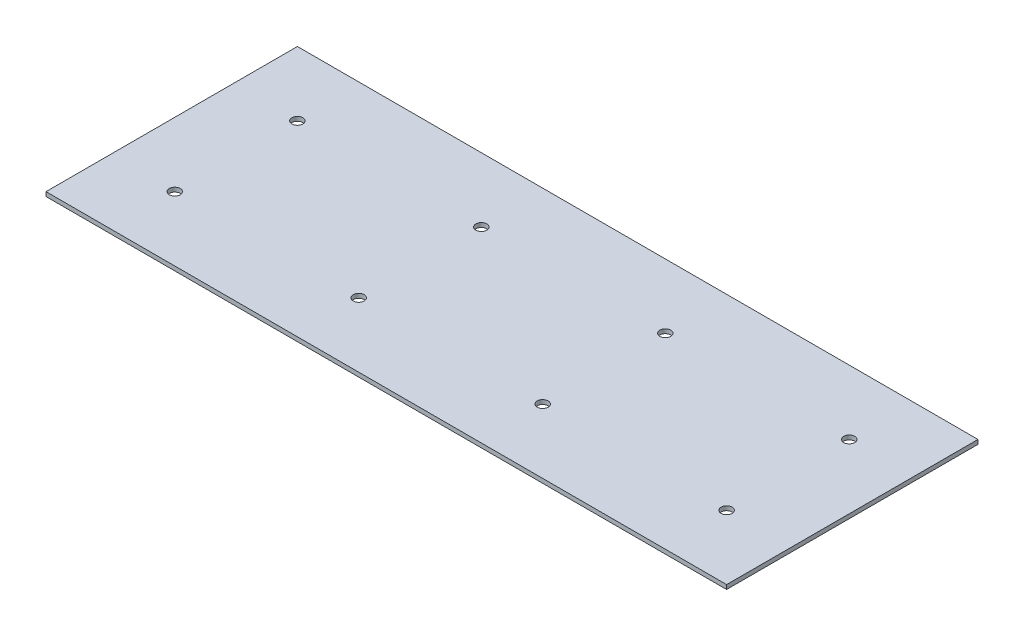
ISO-10303-21;
HEADER;
FILE_DESCRIPTION(('STEP AP214'),'2;1');
FILE_NAME('part.step','',(''),(''),'','','');
FILE_SCHEMA(('AUTOMOTIVE_DESIGN { 1 0 10303 214 1 1 1 1 }'));
ENDSEC;
DATA;
#1=APPLICATION_CONTEXT('core data for automotive mechanical design processes');
#2=APPLICATION_PROTOCOL_DEFINITION('international standard','automotive_design',2000,#1);
#3=PRODUCT_CONTEXT('',#1,'mechanical');
#4=PRODUCT('Part','Part','',(#3));
#5=PRODUCT_RELATED_PRODUCT_CATEGORY('part','',(#4));
#6=PRODUCT_DEFINITION_FORMATION('','',#4);
#7=PRODUCT_DEFINITION_CONTEXT('part definition',#1,'design');
#8=PRODUCT_DEFINITION('design','',#6,#7);
#9=PRODUCT_DEFINITION_SHAPE('','',#8);
#10=(LENGTH_UNIT() NAMED_UNIT(*) SI_UNIT(.MILLI.,.METRE.));
#11=(NAMED_UNIT(*) PLANE_ANGLE_UNIT() SI_UNIT($,.RADIAN.));
#12=(NAMED_UNIT(*) SI_UNIT($,.STERADIAN.) SOLID_ANGLE_UNIT());
#13=UNCERTAINTY_MEASURE_WITH_UNIT(LENGTH_MEASURE(1.E-05),#10,'distance_accuracy_value','');
#14=(GEOMETRIC_REPRESENTATION_CONTEXT(3) GLOBAL_UNCERTAINTY_ASSIGNED_CONTEXT((#13)) GLOBAL_UNIT_ASSIGNED_CONTEXT((#10,
#11,#12)) REPRESENTATION_CONTEXT('',''));
#15=CARTESIAN_POINT('',(0.,0.,0.));
#16=DIRECTION('',(0.,0.,1.));
#17=DIRECTION('',(1.,0.,0.));
#18=AXIS2_PLACEMENT_3D('',#15,#16,#17);
#19=CARTESIAN_POINT('',(0.,1.6,0.));
#20=DIRECTION('',(1.,0.,0.));
#21=DIRECTION('',(0.,0.,-1.));
#22=AXIS2_PLACEMENT_3D('',#19,#20,#21);
#23=PLANE('',#22);
#24=DIRECTION('',(0.,0.,1.));
#25=VECTOR('',#24,1.);
#26=CARTESIAN_POINT('',(0.,0.,0.));
#27=LINE('',#26,#25);
#28=CARTESIAN_POINT('',(0.,0.,-94.3));
#29=VERTEX_POINT('',#28);
#30=CARTESIAN_POINT('',(0.,0.,0.));
#31=VERTEX_POINT('',#30);
#32=EDGE_CURVE('E98',#29,#31,#27,.T.);
#33=ORIENTED_EDGE('',*,*,#32,.T.);
#34=DIRECTION('',(0.,-1.,0.));
#35=VECTOR('',#34,1.);
#36=CARTESIAN_POINT('',(0.,1.6,0.));
#37=LINE('',#36,#35);
#38=CARTESIAN_POINT('',(0.,1.6,0.));
#39=VERTEX_POINT('',#38);
#40=EDGE_CURVE('E11',#39,#31,#37,.T.);
#41=ORIENTED_EDGE('',*,*,#40,.F.);
#42=DIRECTION('',(0.,0.,1.));
#43=VECTOR('',#42,1.);
#44=CARTESIAN_POINT('',(0.,1.6,0.));
#45=LINE('',#44,#43);
#46=CARTESIAN_POINT('',(0.,1.6,-94.3));
#47=VERTEX_POINT('',#46);
#48=EDGE_CURVE('E86',#47,#39,#45,.T.);
#49=ORIENTED_EDGE('',*,*,#48,.F.);
#50=DIRECTION('',(0.,-1.,0.));
#51=VECTOR('',#50,1.);
#52=CARTESIAN_POINT('',(0.,1.6,-94.3));
#53=LINE('',#52,#51);
#54=EDGE_CURVE('E94',#47,#29,#53,.T.);
#55=ORIENTED_EDGE('',*,*,#54,.T.);
#56=EDGE_LOOP('',(#33,#41,#49,#55));
#57=FACE_BOUND('',#56,.T.);
#58=ADVANCED_FACE('F35',(#57),#23,.F.);
#59=CARTESIAN_POINT('',(0.,1.6,0.));
#60=DIRECTION('',(0.,0.,-1.));
#61=DIRECTION('',(-1.,0.,0.));
#62=AXIS2_PLACEMENT_3D('',#59,#60,#61);
#63=PLANE('',#62);
#64=DIRECTION('',(1.,0.,0.));
#65=VECTOR('',#64,1.);
#66=CARTESIAN_POINT('',(0.,0.,0.));
#67=LINE('',#66,#65);
#68=CARTESIAN_POINT('',(255.3,0.,0.));
#69=VERTEX_POINT('',#68);
#70=EDGE_CURVE('E90',#31,#69,#67,.T.);
#71=ORIENTED_EDGE('',*,*,#70,.T.);
#72=DIRECTION('',(0.,-1.,0.));
#73=VECTOR('',#72,1.);
#74=CARTESIAN_POINT('',(255.3,1.6,0.));
#75=LINE('',#74,#73);
#76=CARTESIAN_POINT('',(255.3,1.6,0.));
#77=VERTEX_POINT('',#76);
#78=EDGE_CURVE('E43',#77,#69,#75,.T.);
#79=ORIENTED_EDGE('',*,*,#78,.F.);
#80=DIRECTION('',(1.,0.,0.));
#81=VECTOR('',#80,1.);
#82=CARTESIAN_POINT('',(0.,1.6,0.));
#83=LINE('',#82,#81);
#84=EDGE_CURVE('E81',#39,#77,#83,.T.);
#85=ORIENTED_EDGE('',*,*,#84,.F.);
#86=ORIENTED_EDGE('',*,*,#40,.T.);
#87=EDGE_LOOP('',(#71,#79,#85,#86));
#88=FACE_BOUND('',#87,.T.);
#89=ADVANCED_FACE('F89',(#88),#63,.F.);
#90=CARTESIAN_POINT('',(255.3,1.6,0.));
#91=DIRECTION('',(-1.,0.,0.));
#92=DIRECTION('',(0.,0.,1.));
#93=AXIS2_PLACEMENT_3D('',#90,#91,#92);
#94=PLANE('',#93);
#95=DIRECTION('',(0.,0.,-1.));
#96=VECTOR('',#95,1.);
#97=CARTESIAN_POINT('',(255.3,0.,0.));
#98=LINE('',#97,#96);
#99=CARTESIAN_POINT('',(255.3,0.,-94.3));
#100=VERTEX_POINT('',#99);
#101=EDGE_CURVE('E68',#69,#100,#98,.T.);
#102=ORIENTED_EDGE('',*,*,#101,.T.);
#103=DIRECTION('',(0.,-1.,0.));
#104=VECTOR('',#103,1.);
#105=CARTESIAN_POINT('',(255.3,1.6,-94.3));
#106=LINE('',#105,#104);
#107=CARTESIAN_POINT('',(255.3,1.6,-94.3));
#108=VERTEX_POINT('',#107);
#109=EDGE_CURVE('E91',#108,#100,#106,.T.);
#110=ORIENTED_EDGE('',*,*,#109,.F.);
#111=DIRECTION('',(0.,0.,-1.));
#112=VECTOR('',#111,1.);
#113=CARTESIAN_POINT('',(255.3,1.6,0.));
#114=LINE('',#113,#112);
#115=EDGE_CURVE('E84',#77,#108,#114,.T.);
#116=ORIENTED_EDGE('',*,*,#115,.F.);
#117=ORIENTED_EDGE('',*,*,#78,.T.);
#118=EDGE_LOOP('',(#102,#110,#116,#117));
#119=FACE_BOUND('',#118,.T.);
#120=ADVANCED_FACE('F92',(#119),#94,.F.);
#121=CARTESIAN_POINT('',(0.,1.6,-94.3));
#122=DIRECTION('',(0.,0.,1.));
#123=DIRECTION('',(1.,0.,0.));
#124=AXIS2_PLACEMENT_3D('',#121,#122,#123);
#125=PLANE('',#124);
#126=DIRECTION('',(-1.,0.,0.));
#127=VECTOR('',#126,1.);
#128=CARTESIAN_POINT('',(0.,0.,-94.3));
#129=LINE('',#128,#127);
#130=EDGE_CURVE('E74',#100,#29,#129,.T.);
#131=ORIENTED_EDGE('',*,*,#130,.T.);
#132=ORIENTED_EDGE('',*,*,#54,.F.);
#133=DIRECTION('',(-1.,0.,0.));
#134=VECTOR('',#133,1.);
#135=CARTESIAN_POINT('',(0.,1.6,-94.3));
#136=LINE('',#135,#134);
#137=EDGE_CURVE('E51',#108,#47,#136,.T.);
#138=ORIENTED_EDGE('',*,*,#137,.F.);
#139=ORIENTED_EDGE('',*,*,#109,.T.);
#140=EDGE_LOOP('',(#131,#132,#138,#139));
#141=FACE_BOUND('',#140,.T.);
#142=ADVANCED_FACE('F106',(#141),#125,.F.);
#143=CARTESIAN_POINT('',(0.,1.6,0.));
#144=DIRECTION('',(0.,-1.,0.));
#145=DIRECTION('',(0.,0.,-1.));
#146=AXIS2_PLACEMENT_3D('',#143,#144,#145);
#147=PLANE('',#146);
#148=CARTESIAN_POINT('',(162.15,1.6,-24.15));
#149=DIRECTION('',(0.,1.,0.));
#150=DIRECTION('',(0.,0.,1.));
#151=AXIS2_PLACEMENT_3D('',#148,#149,#150);
#152=CIRCLE('',#151,2.04999999999999);
#153=CARTESIAN_POINT('',(162.15,1.6,-22.1));
#154=VERTEX_POINT('',#153);
#155=EDGE_CURVE('E130',#154,#154,#152,.T.);
#156=ORIENTED_EDGE('',*,*,#155,.F.);
#157=EDGE_LOOP('',(#156));
#158=FACE_BOUND('',#157,.T.);
#159=CARTESIAN_POINT('',(93.15,1.6,-24.15));
#160=DIRECTION('',(0.,1.,0.));
#161=DIRECTION('',(0.,0.,1.));
#162=AXIS2_PLACEMENT_3D('',#159,#160,#161);
#163=CIRCLE('',#162,2.04999999999999);
#164=CARTESIAN_POINT('',(93.15,1.6,-22.1));
#165=VERTEX_POINT('',#164);
#166=EDGE_CURVE('E137',#165,#165,#163,.T.);
#167=ORIENTED_EDGE('',*,*,#166,.F.);
#168=EDGE_LOOP('',(#167));
#169=FACE_BOUND('',#168,.T.);
#170=CARTESIAN_POINT('',(93.15,1.6,-70.15));
#171=DIRECTION('',(0.,1.,0.));
#172=DIRECTION('',(0.,0.,1.));
#173=AXIS2_PLACEMENT_3D('',#170,#171,#172);
#174=CIRCLE('',#173,2.04999999999999);
#175=CARTESIAN_POINT('',(93.15,1.6,-68.1));
#176=VERTEX_POINT('',#175);
#177=EDGE_CURVE('E118',#176,#176,#174,.T.);
#178=ORIENTED_EDGE('',*,*,#177,.F.);
#179=EDGE_LOOP('',(#178));
#180=FACE_BOUND('',#179,.T.);
#181=CARTESIAN_POINT('',(24.15,1.6,-24.15));
#182=DIRECTION('',(0.,1.,0.));
#183=DIRECTION('',(0.,0.,1.));
#184=AXIS2_PLACEMENT_3D('',#181,#182,#183);
#185=CIRCLE('',#184,2.05);
#186=CARTESIAN_POINT('',(24.15,1.6,-22.1));
#187=VERTEX_POINT('',#186);
#188=EDGE_CURVE('E125',#187,#187,#185,.T.);
#189=ORIENTED_EDGE('',*,*,#188,.F.);
#190=EDGE_LOOP('',(#189));
#191=FACE_BOUND('',#190,.T.);
#192=CARTESIAN_POINT('',(162.15,1.6,-70.15));
#193=DIRECTION('',(0.,1.,0.));
#194=DIRECTION('',(0.,0.,1.));
#195=AXIS2_PLACEMENT_3D('',#192,#193,#194);
#196=CIRCLE('',#195,2.04999999999999);
#197=CARTESIAN_POINT('',(162.15,1.6,-68.1));
#198=VERTEX_POINT('',#197);
#199=EDGE_CURVE('E154',#198,#198,#196,.T.);
#200=ORIENTED_EDGE('',*,*,#199,.F.);
#201=EDGE_LOOP('',(#200));
#202=FACE_BOUND('',#201,.T.);
#203=CARTESIAN_POINT('',(231.15,1.6,-70.15));
#204=DIRECTION('',(0.,1.,0.));
#205=DIRECTION('',(0.,0.,1.));
#206=AXIS2_PLACEMENT_3D('',#203,#204,#205);
#207=CIRCLE('',#206,2.04999999999999);
#208=CARTESIAN_POINT('',(231.15,1.6,-68.1));
#209=VERTEX_POINT('',#208);
#210=EDGE_CURVE('E148',#209,#209,#207,.T.);
#211=ORIENTED_EDGE('',*,*,#210,.F.);
#212=EDGE_LOOP('',(#211));
#213=FACE_BOUND('',#212,.T.);
#214=CARTESIAN_POINT('',(231.15,1.6,-24.15));
#215=DIRECTION('',(0.,1.,0.));
#216=DIRECTION('',(0.,0.,1.));
#217=AXIS2_PLACEMENT_3D('',#214,#215,#216);
#218=CIRCLE('',#217,2.04999999999999);
#219=CARTESIAN_POINT('',(231.15,1.6,-22.1));
#220=VERTEX_POINT('',#219);
#221=EDGE_CURVE('E142',#220,#220,#218,.T.);
#222=ORIENTED_EDGE('',*,*,#221,.F.);
#223=EDGE_LOOP('',(#222));
#224=FACE_BOUND('',#223,.T.);
#225=CARTESIAN_POINT('',(24.15,1.6,-70.15));
#226=DIRECTION('',(0.,1.,0.));
#227=DIRECTION('',(0.,0.,1.));
#228=AXIS2_PLACEMENT_3D('',#225,#226,#227);
#229=CIRCLE('',#228,2.05);
#230=CARTESIAN_POINT('',(24.15,1.6,-68.1));
#231=VERTEX_POINT('',#230);
#232=EDGE_CURVE('E112',#231,#231,#229,.T.);
#233=ORIENTED_EDGE('',*,*,#232,.F.);
#234=EDGE_LOOP('',(#233));
#235=FACE_BOUND('',#234,.T.);
#236=ORIENTED_EDGE('',*,*,#48,.T.);
#237=ORIENTED_EDGE('',*,*,#84,.T.);
#238=ORIENTED_EDGE('',*,*,#115,.T.);
#239=ORIENTED_EDGE('',*,*,#137,.T.);
#240=EDGE_LOOP('',(#236,#237,#238,#239));
#241=FACE_BOUND('',#240,.T.);
#242=ADVANCED_FACE('F82',(#158,#169,#180,#191,#202,#213,#224,#235,#241),#147,.F.);
#243=CARTESIAN_POINT('',(0.,0.,0.));
#244=DIRECTION('',(0.,-1.,0.));
#245=DIRECTION('',(0.,0.,-1.));
#246=AXIS2_PLACEMENT_3D('',#243,#244,#245);
#247=PLANE('',#246);
#248=CARTESIAN_POINT('',(162.15,0.,-24.15));
#249=DIRECTION('',(0.,1.,0.));
#250=DIRECTION('',(0.,0.,1.));
#251=AXIS2_PLACEMENT_3D('',#248,#249,#250);
#252=CIRCLE('',#251,2.04999999999999);
#253=CARTESIAN_POINT('',(162.15,0.,-22.1));
#254=VERTEX_POINT('',#253);
#255=EDGE_CURVE('E133',#254,#254,#252,.T.);
#256=ORIENTED_EDGE('',*,*,#255,.T.);
#257=EDGE_LOOP('',(#256));
#258=FACE_BOUND('',#257,.T.);
#259=CARTESIAN_POINT('',(93.15,0.,-24.15));
#260=DIRECTION('',(0.,1.,0.));
#261=DIRECTION('',(0.,0.,1.));
#262=AXIS2_PLACEMENT_3D('',#259,#260,#261);
#263=CIRCLE('',#262,2.04999999999999);
#264=CARTESIAN_POINT('',(93.15,0.,-22.1));
#265=VERTEX_POINT('',#264);
#266=EDGE_CURVE('E122',#265,#265,#263,.T.);
#267=ORIENTED_EDGE('',*,*,#266,.T.);
#268=EDGE_LOOP('',(#267));
#269=FACE_BOUND('',#268,.T.);
#270=CARTESIAN_POINT('',(93.15,0.,-70.15));
#271=DIRECTION('',(0.,1.,0.));
#272=DIRECTION('',(0.,0.,1.));
#273=AXIS2_PLACEMENT_3D('',#270,#271,#272);
#274=CIRCLE('',#273,2.04999999999999);
#275=CARTESIAN_POINT('',(93.15,0.,-68.1));
#276=VERTEX_POINT('',#275);
#277=EDGE_CURVE('E121',#276,#276,#274,.T.);
#278=ORIENTED_EDGE('',*,*,#277,.T.);
#279=EDGE_LOOP('',(#278));
#280=FACE_BOUND('',#279,.T.);
#281=CARTESIAN_POINT('',(24.15,0.,-24.15));
#282=DIRECTION('',(0.,1.,0.));
#283=DIRECTION('',(0.,0.,1.));
#284=AXIS2_PLACEMENT_3D('',#281,#282,#283);
#285=CIRCLE('',#284,2.05);
#286=CARTESIAN_POINT('',(24.15,0.,-22.1));
#287=VERTEX_POINT('',#286);
#288=EDGE_CURVE('E115',#287,#287,#285,.T.);
#289=ORIENTED_EDGE('',*,*,#288,.T.);
#290=EDGE_LOOP('',(#289));
#291=FACE_BOUND('',#290,.T.);
#292=CARTESIAN_POINT('',(162.15,0.,-70.15));
#293=DIRECTION('',(0.,1.,0.));
#294=DIRECTION('',(0.,0.,1.));
#295=AXIS2_PLACEMENT_3D('',#292,#293,#294);
#296=CIRCLE('',#295,2.04999999999999);
#297=CARTESIAN_POINT('',(162.15,0.,-68.1));
#298=VERTEX_POINT('',#297);
#299=EDGE_CURVE('E134',#298,#298,#296,.T.);
#300=ORIENTED_EDGE('',*,*,#299,.T.);
#301=EDGE_LOOP('',(#300));
#302=FACE_BOUND('',#301,.T.);
#303=CARTESIAN_POINT('',(231.15,0.,-70.15));
#304=DIRECTION('',(0.,1.,0.));
#305=DIRECTION('',(0.,0.,1.));
#306=AXIS2_PLACEMENT_3D('',#303,#304,#305);
#307=CIRCLE('',#306,2.04999999999999);
#308=CARTESIAN_POINT('',(231.15,0.,-68.1));
#309=VERTEX_POINT('',#308);
#310=EDGE_CURVE('E151',#309,#309,#307,.T.);
#311=ORIENTED_EDGE('',*,*,#310,.T.);
#312=EDGE_LOOP('',(#311));
#313=FACE_BOUND('',#312,.T.);
#314=CARTESIAN_POINT('',(231.15,0.,-24.15));
#315=DIRECTION('',(0.,1.,0.));
#316=DIRECTION('',(0.,0.,1.));
#317=AXIS2_PLACEMENT_3D('',#314,#315,#316);
#318=CIRCLE('',#317,2.04999999999999);
#319=CARTESIAN_POINT('',(231.15,0.,-22.1));
#320=VERTEX_POINT('',#319);
#321=EDGE_CURVE('E145',#320,#320,#318,.T.);
#322=ORIENTED_EDGE('',*,*,#321,.T.);
#323=EDGE_LOOP('',(#322));
#324=FACE_BOUND('',#323,.T.);
#325=CARTESIAN_POINT('',(24.15,0.,-70.15));
#326=DIRECTION('',(0.,1.,0.));
#327=DIRECTION('',(0.,0.,1.));
#328=AXIS2_PLACEMENT_3D('',#325,#326,#327);
#329=CIRCLE('',#328,2.05);
#330=CARTESIAN_POINT('',(24.15,0.,-68.1));
#331=VERTEX_POINT('',#330);
#332=EDGE_CURVE('E101',#331,#331,#329,.T.);
#333=ORIENTED_EDGE('',*,*,#332,.T.);
#334=EDGE_LOOP('',(#333));
#335=FACE_BOUND('',#334,.T.);
#336=ORIENTED_EDGE('',*,*,#32,.F.);
#337=ORIENTED_EDGE('',*,*,#130,.F.);
#338=ORIENTED_EDGE('',*,*,#101,.F.);
#339=ORIENTED_EDGE('',*,*,#70,.F.);
#340=EDGE_LOOP('',(#336,#337,#338,#339));
#341=FACE_BOUND('',#340,.T.);
#342=ADVANCED_FACE('F109',(#258,#269,#280,#291,#302,#313,#324,#335,#341),#247,.T.);
#343=CARTESIAN_POINT('',(24.15,0.,-70.15));
#344=DIRECTION('',(0.,1.,0.));
#345=DIRECTION('',(0.,0.,1.));
#346=AXIS2_PLACEMENT_3D('',#343,#344,#345);
#347=CYLINDRICAL_SURFACE('',#346,2.05);
#348=ORIENTED_EDGE('',*,*,#332,.F.);
#349=EDGE_LOOP('',(#348));
#350=FACE_BOUND('',#349,.T.);
#351=ORIENTED_EDGE('',*,*,#232,.T.);
#352=EDGE_LOOP('',(#351));
#353=FACE_BOUND('',#352,.T.);
#354=ADVANCED_FACE('F180',(#350,#353),#347,.F.);
#355=CARTESIAN_POINT('',(231.15,0.,-24.15));
#356=DIRECTION('',(0.,1.,0.));
#357=DIRECTION('',(0.,0.,1.));
#358=AXIS2_PLACEMENT_3D('',#355,#356,#357);
#359=CYLINDRICAL_SURFACE('',#358,2.04999999999999);
#360=ORIENTED_EDGE('',*,*,#321,.F.);
#361=EDGE_LOOP('',(#360));
#362=FACE_BOUND('',#361,.T.);
#363=ORIENTED_EDGE('',*,*,#221,.T.);
#364=EDGE_LOOP('',(#363));
#365=FACE_BOUND('',#364,.T.);
#366=ADVANCED_FACE('F182',(#362,#365),#359,.F.);
#367=CARTESIAN_POINT('',(231.15,0.,-70.15));
#368=DIRECTION('',(0.,1.,0.));
#369=DIRECTION('',(0.,0.,1.));
#370=AXIS2_PLACEMENT_3D('',#367,#368,#369);
#371=CYLINDRICAL_SURFACE('',#370,2.04999999999999);
#372=ORIENTED_EDGE('',*,*,#310,.F.);
#373=EDGE_LOOP('',(#372));
#374=FACE_BOUND('',#373,.T.);
#375=ORIENTED_EDGE('',*,*,#210,.T.);
#376=EDGE_LOOP('',(#375));
#377=FACE_BOUND('',#376,.T.);
#378=ADVANCED_FACE('F166',(#374,#377),#371,.F.);
#379=CARTESIAN_POINT('',(162.15,0.,-70.15));
#380=DIRECTION('',(0.,1.,0.));
#381=DIRECTION('',(0.,0.,1.));
#382=AXIS2_PLACEMENT_3D('',#379,#380,#381);
#383=CYLINDRICAL_SURFACE('',#382,2.04999999999999);
#384=ORIENTED_EDGE('',*,*,#299,.F.);
#385=EDGE_LOOP('',(#384));
#386=FACE_BOUND('',#385,.T.);
#387=ORIENTED_EDGE('',*,*,#199,.T.);
#388=EDGE_LOOP('',(#387));
#389=FACE_BOUND('',#388,.T.);
#390=ADVANCED_FACE('F162',(#386,#389),#383,.F.);
#391=CARTESIAN_POINT('',(24.15,0.,-24.15));
#392=DIRECTION('',(0.,1.,0.));
#393=DIRECTION('',(0.,0.,1.));
#394=AXIS2_PLACEMENT_3D('',#391,#392,#393);
#395=CYLINDRICAL_SURFACE('',#394,2.05);
#396=ORIENTED_EDGE('',*,*,#288,.F.);
#397=EDGE_LOOP('',(#396));
#398=FACE_BOUND('',#397,.T.);
#399=ORIENTED_EDGE('',*,*,#188,.T.);
#400=EDGE_LOOP('',(#399));
#401=FACE_BOUND('',#400,.T.);
#402=ADVANCED_FACE('F165',(#398,#401),#395,.F.);
#403=CARTESIAN_POINT('',(93.15,0.,-70.15));
#404=DIRECTION('',(0.,1.,0.));
#405=DIRECTION('',(0.,0.,1.));
#406=AXIS2_PLACEMENT_3D('',#403,#404,#405);
#407=CYLINDRICAL_SURFACE('',#406,2.04999999999999);
#408=ORIENTED_EDGE('',*,*,#277,.F.);
#409=EDGE_LOOP('',(#408));
#410=FACE_BOUND('',#409,.T.);
#411=ORIENTED_EDGE('',*,*,#177,.T.);
#412=EDGE_LOOP('',(#411));
#413=FACE_BOUND('',#412,.T.);
#414=ADVANCED_FACE('F251',(#410,#413),#407,.F.);
#415=CARTESIAN_POINT('',(93.15,0.,-24.15));
#416=DIRECTION('',(0.,1.,0.));
#417=DIRECTION('',(0.,0.,1.));
#418=AXIS2_PLACEMENT_3D('',#415,#416,#417);
#419=CYLINDRICAL_SURFACE('',#418,2.04999999999999);
#420=ORIENTED_EDGE('',*,*,#266,.F.);
#421=EDGE_LOOP('',(#420));
#422=FACE_BOUND('',#421,.T.);
#423=ORIENTED_EDGE('',*,*,#166,.T.);
#424=EDGE_LOOP('',(#423));
#425=FACE_BOUND('',#424,.T.);
#426=ADVANCED_FACE('F261',(#422,#425),#419,.F.);
#427=CARTESIAN_POINT('',(162.15,0.,-24.15));
#428=DIRECTION('',(0.,1.,0.));
#429=DIRECTION('',(0.,0.,1.));
#430=AXIS2_PLACEMENT_3D('',#427,#428,#429);
#431=CYLINDRICAL_SURFACE('',#430,2.04999999999999);
#432=ORIENTED_EDGE('',*,*,#255,.F.);
#433=EDGE_LOOP('',(#432));
#434=FACE_BOUND('',#433,.T.);
#435=ORIENTED_EDGE('',*,*,#155,.T.);
#436=EDGE_LOOP('',(#435));
#437=FACE_BOUND('',#436,.T.);
#438=ADVANCED_FACE('F270',(#434,#437),#431,.F.);
#439=CLOSED_SHELL('',(#58,#89,#120,#142,#242,#342,#354,#366,#378,#390,#402,#414,#426,#438));
#440=MANIFOLD_SOLID_BREP('B2',#439);
#441=ADVANCED_BREP_SHAPE_REPRESENTATION('',(#18,#440),#14);
#442=SHAPE_DEFINITION_REPRESENTATION(#9,#441);
ENDSEC;
END-ISO-10303-21;
